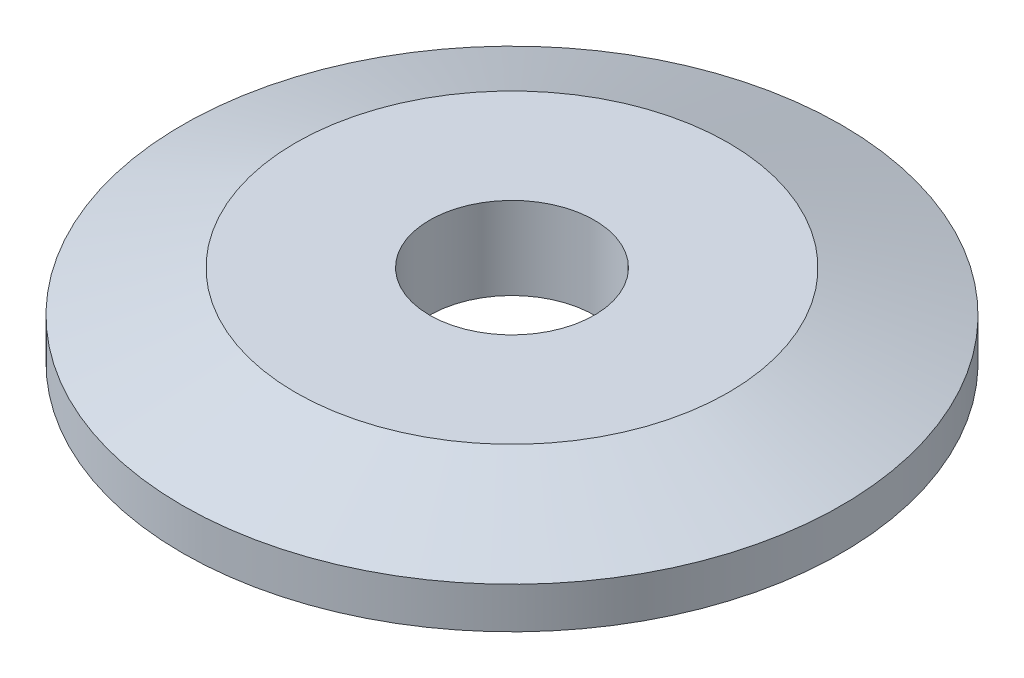
ISO-10303-21;
HEADER;
FILE_DESCRIPTION(('STEP AP214'),'2;1');
FILE_NAME('part.step','',(''),(''),'','','');
FILE_SCHEMA(('AUTOMOTIVE_DESIGN { 1 0 10303 214 1 1 1 1 }'));
ENDSEC;
DATA;
#1=APPLICATION_CONTEXT('core data for automotive mechanical design processes');
#2=APPLICATION_PROTOCOL_DEFINITION('international standard','automotive_design',2000,#1);
#3=PRODUCT_CONTEXT('',#1,'mechanical');
#4=PRODUCT('Part','Part','',(#3));
#5=PRODUCT_RELATED_PRODUCT_CATEGORY('part','',(#4));
#6=PRODUCT_DEFINITION_FORMATION('','',#4);
#7=PRODUCT_DEFINITION_CONTEXT('part definition',#1,'design');
#8=PRODUCT_DEFINITION('design','',#6,#7);
#9=PRODUCT_DEFINITION_SHAPE('','',#8);
#10=(LENGTH_UNIT() NAMED_UNIT(*) SI_UNIT(.MILLI.,.METRE.));
#11=(NAMED_UNIT(*) PLANE_ANGLE_UNIT() SI_UNIT($,.RADIAN.));
#12=(NAMED_UNIT(*) SI_UNIT($,.STERADIAN.) SOLID_ANGLE_UNIT());
#13=UNCERTAINTY_MEASURE_WITH_UNIT(LENGTH_MEASURE(1.E-05),#10,'distance_accuracy_value','');
#14=(GEOMETRIC_REPRESENTATION_CONTEXT(3) GLOBAL_UNCERTAINTY_ASSIGNED_CONTEXT((#13)) GLOBAL_UNIT_ASSIGNED_CONTEXT((#10,
#11,#12)) REPRESENTATION_CONTEXT('',''));
#15=CARTESIAN_POINT('',(0.,0.,0.));
#16=DIRECTION('',(0.,0.,1.));
#17=DIRECTION('',(1.,0.,0.));
#18=AXIS2_PLACEMENT_3D('',#15,#16,#17);
#19=CARTESIAN_POINT('',(0.,2.,0.));
#20=DIRECTION('',(0.,-1.,0.));
#21=DIRECTION('',(0.,0.,-1.));
#22=AXIS2_PLACEMENT_3D('',#19,#20,#21);
#23=CYLINDRICAL_SURFACE('',#22,8.);
#24=CARTESIAN_POINT('',(0.,1.,0.));
#25=DIRECTION('',(0.,1.,0.));
#26=DIRECTION('',(0.,0.,1.));
#27=AXIS2_PLACEMENT_3D('',#24,#25,#26);
#28=CIRCLE('',#27,8.);
#29=CARTESIAN_POINT('',(0.,1.,8.));
#30=VERTEX_POINT('',#29);
#31=EDGE_CURVE('E10',#30,#30,#28,.F.);
#32=ORIENTED_EDGE('',*,*,#31,.T.);
#33=EDGE_LOOP('',(#32));
#34=FACE_BOUND('',#33,.T.);
#35=CARTESIAN_POINT('',(0.,0.,0.));
#36=DIRECTION('',(0.,1.,0.));
#37=DIRECTION('',(0.,0.,1.));
#38=AXIS2_PLACEMENT_3D('',#35,#36,#37);
#39=CIRCLE('',#38,8.);
#40=CARTESIAN_POINT('',(0.,0.,8.));
#41=VERTEX_POINT('',#40);
#42=EDGE_CURVE('E46',#41,#41,#39,.T.);
#43=ORIENTED_EDGE('',*,*,#42,.T.);
#44=EDGE_LOOP('',(#43));
#45=FACE_BOUND('',#44,.T.);
#46=ADVANCED_FACE('F34',(#34,#45),#23,.T.);
#47=CARTESIAN_POINT('',(0.,2.,0.));
#48=DIRECTION('',(0.,1.,0.));
#49=DIRECTION('',(0.,0.,1.));
#50=AXIS2_PLACEMENT_3D('',#47,#48,#49);
#51=PLANE('',#50);
#52=CARTESIAN_POINT('',(0.,2.,0.));
#53=DIRECTION('',(0.,1.,0.));
#54=DIRECTION('',(0.,0.,1.));
#55=AXIS2_PLACEMENT_3D('',#52,#53,#54);
#56=CIRCLE('',#55,2.);
#57=CARTESIAN_POINT('',(0.,2.,2.));
#58=VERTEX_POINT('',#57);
#59=EDGE_CURVE('E52',#58,#58,#56,.T.);
#60=ORIENTED_EDGE('',*,*,#59,.F.);
#61=EDGE_LOOP('',(#60));
#62=FACE_BOUND('',#61,.T.);
#63=CARTESIAN_POINT('',(0.,2.,0.));
#64=DIRECTION('',(0.,1.,0.));
#65=DIRECTION('',(0.,0.,1.));
#66=AXIS2_PLACEMENT_3D('',#63,#64,#65);
#67=CIRCLE('',#66,5.25252258054539);
#68=CARTESIAN_POINT('',(0.,2.,5.25252258054539));
#69=VERTEX_POINT('',#68);
#70=EDGE_CURVE('E45',#69,#69,#67,.T.);
#71=ORIENTED_EDGE('',*,*,#70,.T.);
#72=EDGE_LOOP('',(#71));
#73=FACE_BOUND('',#72,.T.);
#74=ADVANCED_FACE('F66',(#62,#73),#51,.T.);
#75=CARTESIAN_POINT('',(0.,0.,0.));
#76=DIRECTION('',(0.,1.,0.));
#77=DIRECTION('',(0.,0.,1.));
#78=AXIS2_PLACEMENT_3D('',#75,#76,#77);
#79=PLANE('',#78);
#80=CARTESIAN_POINT('',(0.,0.,0.));
#81=DIRECTION('',(0.,1.,0.));
#82=DIRECTION('',(0.,0.,1.));
#83=AXIS2_PLACEMENT_3D('',#80,#81,#82);
#84=CIRCLE('',#83,2.);
#85=CARTESIAN_POINT('',(0.,0.,2.));
#86=VERTEX_POINT('',#85);
#87=EDGE_CURVE('E49',#86,#86,#84,.T.);
#88=ORIENTED_EDGE('',*,*,#87,.T.);
#89=EDGE_LOOP('',(#88));
#90=FACE_BOUND('',#89,.T.);
#91=ORIENTED_EDGE('',*,*,#42,.F.);
#92=EDGE_LOOP('',(#91));
#93=FACE_BOUND('',#92,.T.);
#94=ADVANCED_FACE('F56',(#90,#93),#79,.F.);
#95=CARTESIAN_POINT('',(0.,2.,0.));
#96=DIRECTION('',(0.,-1.,0.));
#97=DIRECTION('',(0.,0.,-1.));
#98=AXIS2_PLACEMENT_3D('',#95,#96,#97);
#99=CONICAL_SURFACE('',#98,5.25252258054539,1.22173047639603);
#100=ORIENTED_EDGE('',*,*,#31,.F.);
#101=EDGE_LOOP('',(#100));
#102=FACE_BOUND('',#101,.T.);
#103=ORIENTED_EDGE('',*,*,#70,.F.);
#104=EDGE_LOOP('',(#103));
#105=FACE_BOUND('',#104,.T.);
#106=ADVANCED_FACE('F40',(#102,#105),#99,.T.);
#107=CARTESIAN_POINT('',(0.,0.,0.));
#108=DIRECTION('',(0.,1.,0.));
#109=DIRECTION('',(0.,0.,1.));
#110=AXIS2_PLACEMENT_3D('',#107,#108,#109);
#111=CYLINDRICAL_SURFACE('',#110,2.);
#112=ORIENTED_EDGE('',*,*,#87,.F.);
#113=EDGE_LOOP('',(#112));
#114=FACE_BOUND('',#113,.T.);
#115=ORIENTED_EDGE('',*,*,#59,.T.);
#116=EDGE_LOOP('',(#115));
#117=FACE_BOUND('',#116,.T.);
#118=ADVANCED_FACE('F61',(#114,#117),#111,.F.);
#119=CLOSED_SHELL('',(#46,#74,#94,#106,#118));
#120=MANIFOLD_SOLID_BREP('B2',#119);
#121=ADVANCED_BREP_SHAPE_REPRESENTATION('',(#18,#120),#14);
#122=SHAPE_DEFINITION_REPRESENTATION(#9,#121);
ENDSEC;
END-ISO-10303-21;
